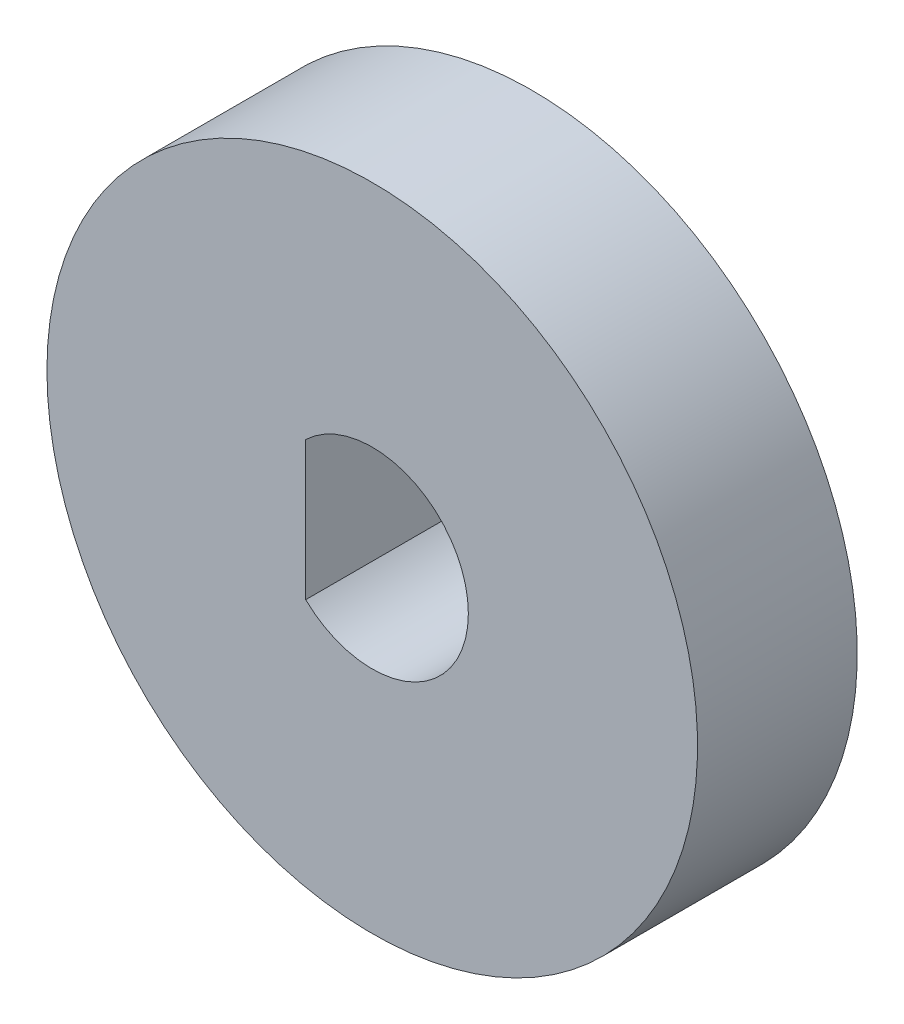
ISO-10303-21;
HEADER;
FILE_DESCRIPTION(('STEP AP214'),'2;1');
FILE_NAME('part.step','',(''),(''),'','','');
FILE_SCHEMA(('AUTOMOTIVE_DESIGN { 1 0 10303 214 1 1 1 1 }'));
ENDSEC;
DATA;
#1=APPLICATION_CONTEXT('core data for automotive mechanical design processes');
#2=APPLICATION_PROTOCOL_DEFINITION('international standard','automotive_design',2000,#1);
#3=PRODUCT_CONTEXT('',#1,'mechanical');
#4=PRODUCT('Part','Part','',(#3));
#5=PRODUCT_RELATED_PRODUCT_CATEGORY('part','',(#4));
#6=PRODUCT_DEFINITION_FORMATION('','',#4);
#7=PRODUCT_DEFINITION_CONTEXT('part definition',#1,'design');
#8=PRODUCT_DEFINITION('design','',#6,#7);
#9=PRODUCT_DEFINITION_SHAPE('','',#8);
#10=(LENGTH_UNIT() NAMED_UNIT(*) SI_UNIT(.MILLI.,.METRE.));
#11=(NAMED_UNIT(*) PLANE_ANGLE_UNIT() SI_UNIT($,.RADIAN.));
#12=(NAMED_UNIT(*) SI_UNIT($,.STERADIAN.) SOLID_ANGLE_UNIT());
#13=UNCERTAINTY_MEASURE_WITH_UNIT(LENGTH_MEASURE(1.E-05),#10,'distance_accuracy_value','');
#14=(GEOMETRIC_REPRESENTATION_CONTEXT(3) GLOBAL_UNCERTAINTY_ASSIGNED_CONTEXT((#13)) GLOBAL_UNIT_ASSIGNED_CONTEXT((#10,
#11,#12)) REPRESENTATION_CONTEXT('',''));
#15=CARTESIAN_POINT('',(0.,0.,0.));
#16=DIRECTION('',(0.,0.,1.));
#17=DIRECTION('',(1.,0.,0.));
#18=AXIS2_PLACEMENT_3D('',#15,#16,#17);
#19=CARTESIAN_POINT('',(0.,0.,5.4));
#20=DIRECTION('',(0.,0.,1.));
#21=DIRECTION('',(1.,0.,0.));
#22=AXIS2_PLACEMENT_3D('',#19,#20,#21);
#23=PLANE('',#22);
#24=CARTESIAN_POINT('',(0.,0.,5.4));
#25=DIRECTION('',(0.,0.,1.));
#26=DIRECTION('',(1.,0.,0.));
#27=AXIS2_PLACEMENT_3D('',#24,#25,#26);
#28=CIRCLE('',#27,10.999999971);
#29=CARTESIAN_POINT('',(-10.999999971,0.,5.4));
#30=VERTEX_POINT('',#29);
#31=EDGE_CURVE('E11',#30,#30,#28,.T.);
#32=ORIENTED_EDGE('',*,*,#31,.T.);
#33=EDGE_LOOP('',(#32));
#34=FACE_BOUND('',#33,.T.);
#35=DIRECTION('',(0.,-1.,0.));
#36=VECTOR('',#35,1.);
#37=CARTESIAN_POINT('',(-2.25,0.,5.4));
#38=LINE('',#37,#36);
#39=CARTESIAN_POINT('',(-2.25,2.34520787991171,5.4));
#40=VERTEX_POINT('',#39);
#41=CARTESIAN_POINT('',(-2.25,-2.34520787991171,5.4));
#42=VERTEX_POINT('',#41);
#43=EDGE_CURVE('E74',#40,#42,#38,.T.);
#44=ORIENTED_EDGE('',*,*,#43,.F.);
#45=CARTESIAN_POINT('',(0.,0.,5.4));
#46=DIRECTION('',(0.,0.,-1.));
#47=DIRECTION('',(-1.,0.,0.));
#48=AXIS2_PLACEMENT_3D('',#45,#46,#47);
#49=CIRCLE('',#48,3.25);
#50=EDGE_CURVE('E65',#42,#40,#49,.F.);
#51=ORIENTED_EDGE('',*,*,#50,.F.);
#52=EDGE_LOOP('',(#44,#51));
#53=FACE_BOUND('',#52,.T.);
#54=ADVANCED_FACE('F33',(#34,#53),#23,.T.);
#55=CARTESIAN_POINT('',(0.,0.,0.));
#56=DIRECTION('',(0.,0.,1.));
#57=DIRECTION('',(1.,0.,0.));
#58=AXIS2_PLACEMENT_3D('',#55,#56,#57);
#59=PLANE('',#58);
#60=CARTESIAN_POINT('',(0.,0.,0.));
#61=DIRECTION('',(0.,0.,1.));
#62=DIRECTION('',(1.,0.,0.));
#63=AXIS2_PLACEMENT_3D('',#60,#61,#62);
#64=CIRCLE('',#63,10.999999971);
#65=CARTESIAN_POINT('',(-10.999999971,0.,0.));
#66=VERTEX_POINT('',#65);
#67=EDGE_CURVE('E37',#66,#66,#64,.T.);
#68=ORIENTED_EDGE('',*,*,#67,.F.);
#69=EDGE_LOOP('',(#68));
#70=FACE_BOUND('',#69,.T.);
#71=CARTESIAN_POINT('',(0.,0.,0.));
#72=DIRECTION('',(0.,0.,-1.));
#73=DIRECTION('',(-1.,0.,0.));
#74=AXIS2_PLACEMENT_3D('',#71,#72,#73);
#75=CIRCLE('',#74,3.25);
#76=CARTESIAN_POINT('',(-2.25,-2.34520787991171,0.));
#77=VERTEX_POINT('',#76);
#78=CARTESIAN_POINT('',(-2.25,2.34520787991171,0.));
#79=VERTEX_POINT('',#78);
#80=EDGE_CURVE('E55',#77,#79,#75,.F.);
#81=ORIENTED_EDGE('',*,*,#80,.T.);
#82=DIRECTION('',(0.,-1.,0.));
#83=VECTOR('',#82,1.);
#84=CARTESIAN_POINT('',(-2.25,0.,0.));
#85=LINE('',#84,#83);
#86=EDGE_CURVE('E61',#79,#77,#85,.T.);
#87=ORIENTED_EDGE('',*,*,#86,.T.);
#88=EDGE_LOOP('',(#81,#87));
#89=FACE_BOUND('',#88,.T.);
#90=ADVANCED_FACE('F71',(#70,#89),#59,.F.);
#91=CARTESIAN_POINT('',(0.,0.,5.4));
#92=DIRECTION('',(0.,0.,-1.));
#93=DIRECTION('',(-1.,0.,0.));
#94=AXIS2_PLACEMENT_3D('',#91,#92,#93);
#95=CYLINDRICAL_SURFACE('',#94,10.999999971);
#96=CARTESIAN_POINT('',(-10.999999971,0.,5.4));
#97=CARTESIAN_POINT('',(-10.999999971,0.,5.34375));
#98=CARTESIAN_POINT('',(-10.999999971,0.,5.2875));
#99=CARTESIAN_POINT('',(-10.999999971,0.,5.175));
#100=CARTESIAN_POINT('',(-10.999999971,0.,5.11875));
#101=CARTESIAN_POINT('',(-10.999999971,0.,5.00625));
#102=CARTESIAN_POINT('',(-10.999999971,0.,4.95));
#103=CARTESIAN_POINT('',(-10.999999971,0.,4.8375));
#104=CARTESIAN_POINT('',(-10.999999971,0.,4.78125));
#105=CARTESIAN_POINT('',(-10.999999971,0.,4.66875));
#106=CARTESIAN_POINT('',(-10.999999971,0.,4.6125));
#107=CARTESIAN_POINT('',(-10.999999971,0.,4.5));
#108=CARTESIAN_POINT('',(-10.999999971,0.,4.44375));
#109=CARTESIAN_POINT('',(-10.999999971,0.,4.33125));
#110=CARTESIAN_POINT('',(-10.999999971,0.,4.275));
#111=CARTESIAN_POINT('',(-10.999999971,0.,4.1625));
#112=CARTESIAN_POINT('',(-10.999999971,0.,4.10625));
#113=CARTESIAN_POINT('',(-10.999999971,0.,3.99375));
#114=CARTESIAN_POINT('',(-10.999999971,0.,3.9375));
#115=CARTESIAN_POINT('',(-10.999999971,0.,3.825));
#116=CARTESIAN_POINT('',(-10.999999971,0.,3.76875));
#117=CARTESIAN_POINT('',(-10.999999971,0.,3.65625));
#118=CARTESIAN_POINT('',(-10.999999971,0.,3.6));
#119=CARTESIAN_POINT('',(-10.999999971,0.,3.4875));
#120=CARTESIAN_POINT('',(-10.999999971,0.,3.43125));
#121=CARTESIAN_POINT('',(-10.999999971,0.,3.31875));
#122=CARTESIAN_POINT('',(-10.999999971,0.,3.2625));
#123=CARTESIAN_POINT('',(-10.999999971,0.,3.15));
#124=CARTESIAN_POINT('',(-10.999999971,0.,3.09375));
#125=CARTESIAN_POINT('',(-10.999999971,0.,2.98125));
#126=CARTESIAN_POINT('',(-10.999999971,0.,2.925));
#127=CARTESIAN_POINT('',(-10.999999971,0.,2.8125));
#128=CARTESIAN_POINT('',(-10.999999971,0.,2.75625));
#129=CARTESIAN_POINT('',(-10.999999971,0.,2.64375));
#130=CARTESIAN_POINT('',(-10.999999971,0.,2.5875));
#131=CARTESIAN_POINT('',(-10.999999971,0.,2.475));
#132=CARTESIAN_POINT('',(-10.999999971,0.,2.41875));
#133=CARTESIAN_POINT('',(-10.999999971,0.,2.30625));
#134=CARTESIAN_POINT('',(-10.999999971,0.,2.25));
#135=CARTESIAN_POINT('',(-10.999999971,0.,2.1375));
#136=CARTESIAN_POINT('',(-10.999999971,0.,2.08125));
#137=CARTESIAN_POINT('',(-10.999999971,0.,1.96875));
#138=CARTESIAN_POINT('',(-10.999999971,0.,1.9125));
#139=CARTESIAN_POINT('',(-10.999999971,0.,1.8));
#140=CARTESIAN_POINT('',(-10.999999971,0.,1.74375));
#141=CARTESIAN_POINT('',(-10.999999971,0.,1.63125));
#142=CARTESIAN_POINT('',(-10.999999971,0.,1.575));
#143=CARTESIAN_POINT('',(-10.999999971,0.,1.4625));
#144=CARTESIAN_POINT('',(-10.999999971,0.,1.40625));
#145=CARTESIAN_POINT('',(-10.999999971,0.,1.29375));
#146=CARTESIAN_POINT('',(-10.999999971,0.,1.2375));
#147=CARTESIAN_POINT('',(-10.999999971,0.,1.125));
#148=CARTESIAN_POINT('',(-10.999999971,0.,1.06875));
#149=CARTESIAN_POINT('',(-10.999999971,0.,0.956249999999999));
#150=CARTESIAN_POINT('',(-10.999999971,0.,0.899999999999999));
#151=CARTESIAN_POINT('',(-10.999999971,0.,0.787499999999999));
#152=CARTESIAN_POINT('',(-10.999999971,0.,0.731249999999999));
#153=CARTESIAN_POINT('',(-10.999999971,0.,0.618749999999999));
#154=CARTESIAN_POINT('',(-10.999999971,0.,0.562499999999999));
#155=CARTESIAN_POINT('',(-10.999999971,0.,0.449999999999999));
#156=CARTESIAN_POINT('',(-10.999999971,0.,0.393749999999999));
#157=CARTESIAN_POINT('',(-10.999999971,0.,0.281249999999999));
#158=CARTESIAN_POINT('',(-10.999999971,0.,0.224999999999999));
#159=CARTESIAN_POINT('',(-10.999999971,0.,0.112499999999999));
#160=CARTESIAN_POINT('',(-10.999999971,0.,0.0562499999999989));
#161=CARTESIAN_POINT('',(-10.999999971,0.,0.));
#162=B_SPLINE_CURVE_WITH_KNOTS('',3,(#96,#97,#98,#99,#100,#101,#102,#103,#104,#105,#106,#107,
#108,#109,#110,#111,#112,#113,#114,#115,#116,#117,#118,#119,#120,#121,#122,#123,#124,#125,#126,
#127,#128,#129,#130,#131,#132,#133,#134,#135,#136,#137,#138,#139,#140,#141,#142,#143,#144,#145,
#146,#147,#148,#149,#150,#151,#152,#153,#154,#155,#156,#157,#158,#159,#160,#161),.UNSPECIFIED.,
.F.,.F.,(4,2,2,2,2,2,2,2,2,2,2,2,2,2,2,2,2,2,2,2,2,2,2,2,2,2,2,2,2,2,2,2,4),(0.,0.16875,
0.337499999999999,0.50625,0.674999999999999,0.84375,1.0125,1.18125,1.35,1.51875,1.6875,1.85625,
2.025,2.19375,2.3625,2.53125,2.7,2.86875,3.0375,3.20625,3.375,3.54375,3.7125,3.88125,4.05,
4.21875,4.3875,4.55625,4.725,4.89375,5.0625,5.23125,5.4),.UNSPECIFIED.);
#163=EDGE_CURVE('BSEAM35',#30,#66,#162,.T.);
#164=ORIENTED_EDGE('',*,*,#31,.F.);
#165=ORIENTED_EDGE('',*,*,#67,.T.);
#166=ORIENTED_EDGE('',*,*,#163,.T.);
#167=ORIENTED_EDGE('',*,*,#163,.F.);
#168=EDGE_LOOP('',(#164,#166,#165,#167));
#169=FACE_BOUND('',#168,.T.);
#170=ADVANCED_FACE('F35',(#169),#95,.T.);
#171=CARTESIAN_POINT('',(0.,0.,5.4));
#172=DIRECTION('',(0.,0.,-1.));
#173=DIRECTION('',(-1.,0.,0.));
#174=AXIS2_PLACEMENT_3D('',#171,#172,#173);
#175=CYLINDRICAL_SURFACE('',#174,3.25);
#176=ORIENTED_EDGE('',*,*,#80,.F.);
#177=DIRECTION('',(0.,0.,-1.));
#178=VECTOR('',#177,1.);
#179=CARTESIAN_POINT('',(-2.25,-2.34520787991171,5.4));
#180=LINE('',#179,#178);
#181=EDGE_CURVE('E63',#42,#77,#180,.T.);
#182=ORIENTED_EDGE('',*,*,#181,.F.);
#183=ORIENTED_EDGE('',*,*,#50,.T.);
#184=DIRECTION('',(0.,0.,-1.));
#185=VECTOR('',#184,1.);
#186=CARTESIAN_POINT('',(-2.25,2.34520787991171,5.4));
#187=LINE('',#186,#185);
#188=EDGE_CURVE('E48',#40,#79,#187,.T.);
#189=ORIENTED_EDGE('',*,*,#188,.T.);
#190=EDGE_LOOP('',(#176,#182,#183,#189));
#191=FACE_BOUND('',#190,.T.);
#192=ADVANCED_FACE('F67',(#191),#175,.F.);
#193=CARTESIAN_POINT('',(-2.25,0.,5.4));
#194=DIRECTION('',(1.,0.,0.));
#195=DIRECTION('',(0.,0.,-1.));
#196=AXIS2_PLACEMENT_3D('',#193,#194,#195);
#197=PLANE('',#196);
#198=ORIENTED_EDGE('',*,*,#86,.F.);
#199=ORIENTED_EDGE('',*,*,#188,.F.);
#200=ORIENTED_EDGE('',*,*,#43,.T.);
#201=ORIENTED_EDGE('',*,*,#181,.T.);
#202=EDGE_LOOP('',(#198,#199,#200,#201));
#203=FACE_BOUND('',#202,.T.);
#204=ADVANCED_FACE('F62',(#203),#197,.T.);
#205=CLOSED_SHELL('',(#54,#90,#170,#192,#204));
#206=MANIFOLD_SOLID_BREP('B2',#205);
#207=ADVANCED_BREP_SHAPE_REPRESENTATION('',(#18,#206),#14);
#208=SHAPE_DEFINITION_REPRESENTATION(#9,#207);
ENDSEC;
END-ISO-10303-21;
